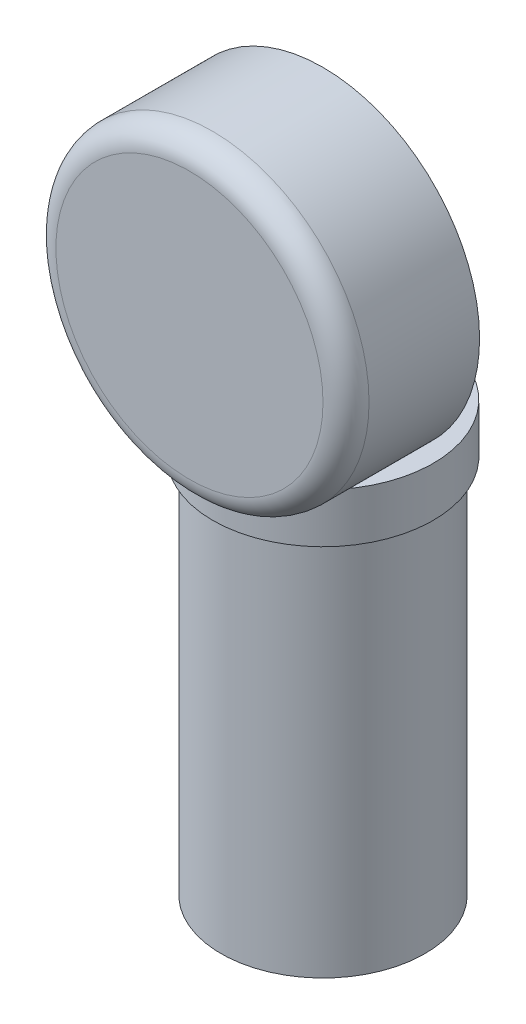
ISO-10303-21;
HEADER;
FILE_DESCRIPTION(('STEP AP214'),'2;1');
FILE_NAME('part.step','',(''),(''),'','','');
FILE_SCHEMA(('AUTOMOTIVE_DESIGN { 1 0 10303 214 1 1 1 1 }'));
ENDSEC;
DATA;
#1=APPLICATION_CONTEXT('core data for automotive mechanical design processes');
#2=APPLICATION_PROTOCOL_DEFINITION('international standard','automotive_design',2000,#1);
#3=PRODUCT_CONTEXT('',#1,'mechanical');
#4=PRODUCT('Part','Part','',(#3));
#5=PRODUCT_RELATED_PRODUCT_CATEGORY('part','',(#4));
#6=PRODUCT_DEFINITION_FORMATION('','',#4);
#7=PRODUCT_DEFINITION_CONTEXT('part definition',#1,'design');
#8=PRODUCT_DEFINITION('design','',#6,#7);
#9=PRODUCT_DEFINITION_SHAPE('','',#8);
#10=(LENGTH_UNIT() NAMED_UNIT(*) SI_UNIT(.MILLI.,.METRE.));
#11=(NAMED_UNIT(*) PLANE_ANGLE_UNIT() SI_UNIT($,.RADIAN.));
#12=(NAMED_UNIT(*) SI_UNIT($,.STERADIAN.) SOLID_ANGLE_UNIT());
#13=UNCERTAINTY_MEASURE_WITH_UNIT(LENGTH_MEASURE(1.E-05),#10,'distance_accuracy_value','');
#14=(GEOMETRIC_REPRESENTATION_CONTEXT(3) GLOBAL_UNCERTAINTY_ASSIGNED_CONTEXT((#13)) GLOBAL_UNIT_ASSIGNED_CONTEXT((#10,
#11,#12)) REPRESENTATION_CONTEXT('',''));
#15=CARTESIAN_POINT('',(0.,0.,0.));
#16=DIRECTION('',(0.,0.,1.));
#17=DIRECTION('',(1.,0.,0.));
#18=AXIS2_PLACEMENT_3D('',#15,#16,#17);
#19=CARTESIAN_POINT('',(-6.27280772405116,-36.2819099170688,0.));
#20=DIRECTION('',(0.,-1.,0.));
#21=DIRECTION('',(0.,0.,-1.));
#22=AXIS2_PLACEMENT_3D('',#19,#20,#21);
#23=PLANE('',#22);
#24=CARTESIAN_POINT('',(-6.27280772405116,-36.2819099170688,0.));
#25=DIRECTION('',(0.,1.,0.));
#26=DIRECTION('',(0.,0.,1.));
#27=AXIS2_PLACEMENT_3D('',#24,#25,#26);
#28=CIRCLE('',#27,6.08020546064516);
#29=CARTESIAN_POINT('',(-6.27280772405116,-36.2819099170688,6.08020546064516));
#30=VERTEX_POINT('',#29);
#31=EDGE_CURVE('E68',#30,#30,#28,.T.);
#32=ORIENTED_EDGE('',*,*,#31,.F.);
#33=EDGE_LOOP('',(#32));
#34=FACE_BOUND('',#33,.T.);
#35=CARTESIAN_POINT('',(-6.27280772405116,-36.2819099170688,0.));
#36=DIRECTION('',(0.,-1.,0.));
#37=DIRECTION('',(0.,0.,-1.));
#38=AXIS2_PLACEMENT_3D('',#35,#36,#37);
#39=CIRCLE('',#38,5.62683403156341);
#40=CARTESIAN_POINT('',(-6.27280772405116,-36.2819099170688,-5.62683403156341));
#41=VERTEX_POINT('',#40);
#42=EDGE_CURVE('E168',#41,#41,#39,.T.);
#43=ORIENTED_EDGE('',*,*,#42,.F.);
#44=EDGE_LOOP('',(#43));
#45=FACE_BOUND('',#44,.T.);
#46=ADVANCED_FACE('F30',(#34,#45),#23,.T.);
#47=CARTESIAN_POINT('',(-6.27280772405116,-26.3143599815849,7.36599999999998));
#48=DIRECTION('',(0.,0.,-1.));
#49=DIRECTION('',(-1.,0.,0.));
#50=AXIS2_PLACEMENT_3D('',#47,#48,#49);
#51=CYLINDRICAL_SURFACE('',#50,8.636);
#52=CARTESIAN_POINT('',(-6.27280772405116,-26.3143599815849,6.09599999999998));
#53=DIRECTION('',(0.,0.,1.));
#54=DIRECTION('',(1.,0.,0.));
#55=AXIS2_PLACEMENT_3D('',#52,#53,#54);
#56=CIRCLE('',#55,8.636);
#57=CARTESIAN_POINT('',(2.36319227594884,-26.3143599815849,6.09599999999998));
#58=VERTEX_POINT('',#57);
#59=EDGE_CURVE('E80',#58,#58,#56,.F.);
#60=ORIENTED_EDGE('',*,*,#59,.T.);
#61=EDGE_LOOP('',(#60));
#62=FACE_BOUND('',#61,.T.);
#63=CARTESIAN_POINT('',(-6.27280772405116,-34.9503599815849,6.08020546064516));
#64=CARTESIAN_POINT('',(-6.12182758212127,-34.950360839252,6.0802063714684));
#65=CARTESIAN_POINT('',(-5.97085816476798,-34.9463929394153,6.07457474459403));
#66=CARTESIAN_POINT('',(-5.67016275735546,-34.9306223813735,6.05214379416389));
#67=CARTESIAN_POINT('',(-5.52043676365703,-34.918819746107,6.03534450330483));
#68=CARTESIAN_POINT('',(-5.22340073069609,-34.8876643386465,5.99084317135875));
#69=CARTESIAN_POINT('',(-5.07609099512552,-34.8683106248442,5.96313977054162));
#70=CARTESIAN_POINT('',(-4.78496948308177,-34.8225061793963,5.89724632724683));
#71=CARTESIAN_POINT('',(-4.64115782839198,-34.7960552010486,5.85905592023811));
#72=CARTESIAN_POINT('',(-4.35867580298397,-34.7367889898985,5.77292695861879));
#73=CARTESIAN_POINT('',(-4.21998283921504,-34.7040071071529,5.72503942519365));
#74=CARTESIAN_POINT('',(-3.94768231058322,-34.6326611205405,5.61996586254378));
#75=CARTESIAN_POINT('',(-3.81407663460476,-34.5940948947263,5.56277642032332));
#76=CARTESIAN_POINT('',(-3.42192110617729,-34.4708206741843,5.37816926246686));
#77=CARTESIAN_POINT('',(-3.1717951489574,-34.3784854044519,5.23763902250488));
#78=CARTESIAN_POINT('',(-2.67665176978472,-34.1709903975482,4.9124444579008));
#79=CARTESIAN_POINT('',(-2.43405547630322,-34.0545325839461,4.72497105419681));
#80=CARTESIAN_POINT('',(-1.98144577227559,-33.8130596143578,4.31808357713596));
#81=CARTESIAN_POINT('',(-1.77148215337477,-33.6880317928751,4.09862166471254));
#82=CARTESIAN_POINT('',(-1.46549685427991,-33.4899161441971,3.72699960312644));
#83=CARTESIAN_POINT('',(-1.35807872586271,-33.4165716835784,3.58418534688732));
#84=CARTESIAN_POINT('',(-1.15569284193418,-33.272165788658,3.28878359957141));
#85=CARTESIAN_POINT('',(-1.06072836355384,-33.2011049589842,3.13619355169321));
#86=CARTESIAN_POINT('',(-0.884038803699651,-33.0637434770409,2.82179349303375));
#87=CARTESIAN_POINT('',(-0.802294508863332,-32.9974359960868,2.65999733299808));
#88=CARTESIAN_POINT('',(-0.652729286396061,-32.8721585904756,2.32742389971116));
#89=CARTESIAN_POINT('',(-0.584906395551781,-32.8131876316759,2.15664789708095));
#90=CARTESIAN_POINT('',(-0.441876249965573,-32.6856298045542,1.74164290380118));
#91=CARTESIAN_POINT('',(-0.373219098104523,-32.6215560786156,1.49361228337817));
#92=CARTESIAN_POINT('',(-0.293918205789608,-32.5461080147967,1.1129321387857));
#93=CARTESIAN_POINT('',(-0.271436989047147,-32.5244076930162,0.984661175112826));
#94=CARTESIAN_POINT('',(-0.234678279629278,-32.4886741609096,0.725902833519679));
#95=CARTESIAN_POINT('',(-0.22039761207438,-32.4746379834791,0.595416333526014));
#96=CARTESIAN_POINT('',(-0.20025040191613,-32.4547790635678,0.332354765323989));
#97=CARTESIAN_POINT('',(-0.194436398090059,-32.449007610403,0.199771773685017));
#98=CARTESIAN_POINT('',(-0.191508520587281,-32.4461053284381,-0.0655838807517806));
#99=CARTESIAN_POINT('',(-0.194394408041896,-32.4489742624031,-0.198356538241999));
#100=CARTESIAN_POINT('',(-0.208809964193385,-32.4632239240657,-0.463041259061182));
#101=CARTESIAN_POINT('',(-0.220344507112269,-32.474609451549,-0.594952794775049));
#102=CARTESIAN_POINT('',(-0.251836752279032,-32.505392668051,-0.856866986625794));
#103=CARTESIAN_POINT('',(-0.27179863368914,-32.5247943322129,-0.986868662508698));
#104=CARTESIAN_POINT('',(-0.323057027705727,-32.573943433209,-1.26151907234019));
#105=CARTESIAN_POINT('',(-0.355523730223377,-32.6047372348682,-1.40576265359948));
#106=CARTESIAN_POINT('',(-0.430274233523286,-32.6742268663125,-1.68976420873328));
#107=CARTESIAN_POINT('',(-0.472564642387174,-32.7129280129867,-1.8295190908579));
#108=CARTESIAN_POINT('',(-0.613400246992451,-32.8387283979856,-2.24148361344046));
#109=CARTESIAN_POINT('',(-0.725862574318351,-32.9354762164405,-2.50614807047482));
#110=CARTESIAN_POINT('',(-0.937821284170871,-33.1062572586609,-2.92240711055735));
#111=CARTESIAN_POINT('',(-1.02777121316522,-33.1761778097678,-3.08081366469654));
#112=CARTESIAN_POINT('',(-1.22072443905945,-33.3194562983821,-3.38795110658393));
#113=CARTESIAN_POINT('',(-1.32373116491357,-33.3928151356454,-3.53667943706914));
#114=CARTESIAN_POINT('',(-1.54231441667562,-33.5407260856052,-3.82413036999678));
#115=CARTESIAN_POINT('',(-1.65790046482433,-33.6152790653188,-3.96284525853147));
#116=CARTESIAN_POINT('',(-1.90118764959011,-33.7635022700277,-4.22970747293164));
#117=CARTESIAN_POINT('',(-2.0288876209254,-33.8371725791638,-4.35785581301914));
#118=CARTESIAN_POINT('',(-2.2971676500341,-33.9823609267174,-4.60397583503645));
#119=CARTESIAN_POINT('',(-2.43784543452535,-34.0538561454282,-4.72185465759165));
#120=CARTESIAN_POINT('',(-2.73077522400977,-34.1922237698826,-4.94538598532523));
#121=CARTESIAN_POINT('',(-2.88302832778588,-34.2590957356124,-5.05103732740752));
#122=CARTESIAN_POINT('',(-3.19821042543973,-34.3862973559236,-5.24883781173237));
#123=CARTESIAN_POINT('',(-3.36111840287321,-34.4466393014835,-5.34101243925657));
#124=CARTESIAN_POINT('',(-3.6969887686162,-34.5591755487012,-5.510846696945));
#125=CARTESIAN_POINT('',(-3.86994737279798,-34.6113728899267,-5.58851174423223));
#126=CARTESIAN_POINT('',(-4.17958874625599,-34.6939599317106,-5.71030238146495));
#127=CARTESIAN_POINT('',(-4.31432403918882,-34.726520940765,-5.75793601800367));
#128=CARTESIAN_POINT('',(-4.58802048735653,-34.7855802299085,-5.8438815452702));
#129=CARTESIAN_POINT('',(-4.72698074474364,-34.8120797880555,-5.88219540118327));
#130=CARTESIAN_POINT('',(-5.0082522634317,-34.858463274667,-5.94900674934513));
#131=CARTESIAN_POINT('',(-5.15056173334508,-34.8783506573702,-5.97750936731706));
#132=CARTESIAN_POINT('',(-5.43765623632309,-34.9110971199486,-6.02433169503464));
#133=CARTESIAN_POINT('',(-5.58244134125479,-34.9239559954296,-6.04265110864536));
#134=CARTESIAN_POINT('',(-5.87383602414972,-34.942377686195,-6.06886970765923));
#135=CARTESIAN_POINT('',(-6.02044963167348,-34.9479195602315,-6.07673898515825));
#136=CARTESIAN_POINT('',(-6.31395385605131,-34.9515089439275,-6.08183754675664));
#137=CARTESIAN_POINT('',(-6.4608444722228,-34.9495564720302,-6.07906685704025));
#138=CARTESIAN_POINT('',(-6.7537686433489,-34.9382024599001,-6.06292786778696));
#139=CARTESIAN_POINT('',(-6.8998020880043,-34.9287999813035,-6.04955823326221));
#140=CARTESIAN_POINT('',(-7.18988055441477,-34.9027639473091,-6.01242544580199));
#141=CARTESIAN_POINT('',(-7.33392560243798,-34.8861304875323,-5.98866243030636));
#142=CARTESIAN_POINT('',(-7.61308267589068,-34.8468384399348,-5.93228313187176));
#143=CARTESIAN_POINT('',(-7.74831705994887,-34.8244592255949,-5.90007618479412));
#144=CARTESIAN_POINT('',(-8.01526737605205,-34.773841157113,-5.82682747239861));
#145=CARTESIAN_POINT('',(-8.14698208021854,-34.7456002874306,-5.7857826679862));
#146=CARTESIAN_POINT('',(-8.53572410371695,-34.6528546766145,-5.65007158646898));
#147=CARTESIAN_POINT('',(-8.78655917322666,-34.5802962376912,-5.54278542195723));
#148=CARTESIAN_POINT('',(-9.29030920159082,-34.4108149346538,-5.28687448134575));
#149=CARTESIAN_POINT('',(-9.54112294103336,-34.3122242383191,-5.13527482402616));
#150=CARTESIAN_POINT('',(-10.0150771255766,-34.1017320956216,-4.80088626336528));
#151=CARTESIAN_POINT('',(-10.2381935033919,-33.989819236241,-4.61807055833436));
#152=CARTESIAN_POINT('',(-10.5692054479243,-33.8071028184969,-4.30562311054284));
#153=CARTESIAN_POINT('',(-10.6868226531887,-33.7382667422516,-4.18493586633868));
#154=CARTESIAN_POINT('',(-10.9114939858632,-33.599993837733,-3.93443571806909));
#155=CARTESIAN_POINT('',(-11.0185503296336,-33.530557138851,-3.80462473859571));
#156=CARTESIAN_POINT('',(-11.2218447305029,-33.3926803844345,-3.53614102868273));
#157=CARTESIAN_POINT('',(-11.3180766285975,-33.3242409153978,-3.39746332283687));
#158=CARTESIAN_POINT('',(-11.4991933618796,-33.1902666364639,-3.11166155891045));
#159=CARTESIAN_POINT('',(-11.5840804811025,-33.1247312436727,-2.96453920953549));
#160=CARTESIAN_POINT('',(-11.7929954439671,-32.9578218085892,-2.56421268291352));
#161=CARTESIAN_POINT('',(-11.9069793806371,-32.8605785575238,-2.30376198527085));
#162=CARTESIAN_POINT('',(-12.0508942074987,-32.7329548204359,-1.89820661566485));
#163=CARTESIAN_POINT('',(-12.094342738244,-32.6934668535111,-1.76060408308878));
#164=CARTESIAN_POINT('',(-12.1717004299791,-32.6220004497914,-1.48087210470489));
#165=CARTESIAN_POINT('',(-12.2056159369781,-32.5900170196792,-1.33874574084755));
#166=CARTESIAN_POINT('',(-12.2585797348054,-32.5394817914773,-1.0744720721293));
#167=CARTESIAN_POINT('',(-12.2791561713099,-32.5195857729168,-0.952885999026663));
#168=CARTESIAN_POINT('',(-12.3129392035675,-32.4867068675063,-0.707811191505076));
#169=CARTESIAN_POINT('',(-12.3261492927761,-32.4737207038242,-0.584323387575758));
#170=CARTESIAN_POINT('',(-12.3449799065613,-32.4551578057299,-0.33627970223861));
#171=CARTESIAN_POINT('',(-12.3506046224302,-32.4495769795316,-0.211724448971407));
#172=CARTESIAN_POINT('',(-12.3541751577533,-32.4460377315236,0.0376080507890457));
#173=CARTESIAN_POINT('',(-12.3521208132056,-32.4480794725093,0.162385301966627));
#174=CARTESIAN_POINT('',(-12.3403761509708,-32.459698004582,0.411080684594492));
#175=CARTESIAN_POINT('',(-12.3306946823503,-32.4692660635392,0.534999643871226));
#176=CARTESIAN_POINT('',(-12.303882501561,-32.4955386981204,0.781282217611884));
#177=CARTESIAN_POINT('',(-12.2867492314137,-32.5122457243018,0.903645283125982));
#178=CARTESIAN_POINT('',(-12.2245284142977,-32.5722292863014,1.26743486997021));
#179=CARTESIAN_POINT('',(-12.1686252190546,-32.6253624966728,1.50545526506624));
#180=CARTESIAN_POINT('',(-12.0058025108181,-32.7741721483763,2.05179351314644));
#181=CARTESIAN_POINT('',(-11.8877502900736,-32.8782827846253,2.35445846088297));
#182=CARTESIAN_POINT('',(-11.6791311677519,-33.0493688054704,2.7868088662144));
#183=CARTESIAN_POINT('',(-11.6042162053418,-33.1089717280282,2.92748722388883));
#184=CARTESIAN_POINT('',(-11.4442909182467,-33.231467691899,3.20153066099865));
#185=CARTESIAN_POINT('',(-11.3592814872095,-33.2943604416931,3.33489638628455));
#186=CARTESIAN_POINT('',(-11.1773487202686,-33.4234196767145,3.59729186591927));
#187=CARTESIAN_POINT('',(-11.0801811553613,-33.4896286888943,3.72613056672692));
#188=CARTESIAN_POINT('',(-10.8759972668257,-33.6222983953372,3.97561587716325));
#189=CARTESIAN_POINT('',(-10.7689810383115,-33.6887590871638,4.09626256588721));
#190=CARTESIAN_POINT('',(-10.5454410020698,-33.8204855627597,4.3289154580606));
#191=CARTESIAN_POINT('',(-10.4289240675743,-33.8857521692574,4.44092779583842));
#192=CARTESIAN_POINT('',(-10.1865664245721,-34.0138256864562,4.65592388747999));
#193=CARTESIAN_POINT('',(-10.0607258733588,-34.0766326386254,4.7589077935933));
#194=CARTESIAN_POINT('',(-9.8056774418525,-34.1958748421009,4.95096908818851));
#195=CARTESIAN_POINT('',(-9.67685228862139,-34.2524682959558,5.0404558889484));
#196=CARTESIAN_POINT('',(-9.41134690624862,-34.3611377138092,5.20991930898707));
#197=CARTESIAN_POINT('',(-9.27466993712418,-34.4132155304509,5.28989983347383));
#198=CARTESIAN_POINT('',(-8.99385520688584,-34.5118318908357,5.43968069830153));
#199=CARTESIAN_POINT('',(-8.84971507185308,-34.5583686563303,5.50947777215364));
#200=CARTESIAN_POINT('',(-8.55475616836273,-34.6448348403038,5.63803828192333));
#201=CARTESIAN_POINT('',(-8.40394060444938,-34.6847673864566,5.69680694254278));
#202=CARTESIAN_POINT('',(-8.09390014192865,-34.7576941547101,5.80343288423995));
#203=CARTESIAN_POINT('',(-7.9345771357777,-34.7905620233932,5.85109257220067));
#204=CARTESIAN_POINT('',(-7.61107770791994,-34.8476184728114,5.93344634111633));
#205=CARTESIAN_POINT('',(-7.446901236124,-34.871806963939,5.9681402882107));
#206=CARTESIAN_POINT('',(-7.11527225062274,-34.9107894619232,6.02390238480121));
#207=CARTESIAN_POINT('',(-6.94782234858993,-34.9255906663925,6.04498097397299));
#208=CARTESIAN_POINT('',(-6.61117957538042,-34.9453748539328,6.07313115735573));
#209=CARTESIAN_POINT('',(-6.44198691678116,-34.9503590205352,6.08020444003185));
#210=CARTESIAN_POINT('',(-6.27280772405116,-34.9503599815849,6.08020546064516));
#211=B_SPLINE_CURVE_WITH_KNOTS('',3,(#63,#64,#65,#66,#67,#68,#69,#70,#71,#72,#73,#74,#75,#76,
#77,#78,#79,#80,#81,#82,#83,#84,#85,#86,#87,#88,#89,#90,#91,#92,#93,#94,#95,#96,#97,#98,#99,
#100,#101,#102,#103,#104,#105,#106,#107,#108,#109,#110,#111,#112,#113,#114,#115,#116,#117,#118,
#119,#120,#121,#122,#123,#124,#125,#126,#127,#128,#129,#130,#131,#132,#133,#134,#135,#136,#137,
#138,#139,#140,#141,#142,#143,#144,#145,#146,#147,#148,#149,#150,#151,#152,#153,#154,#155,#156,
#157,#158,#159,#160,#161,#162,#163,#164,#165,#166,#167,#168,#169,#170,#171,#172,#173,#174,#175,
#176,#177,#178,#179,#180,#181,#182,#183,#184,#185,#186,#187,#188,#189,#190,#191,#192,#193,#194,
#195,#196,#197,#198,#199,#200,#201,#202,#203,#204,#205,#206,#207,#208,#209,#210),.UNSPECIFIED.,
.T.,.F.,(4,2,2,2,2,2,2,2,2,2,2,2,2,2,2,2,2,2,2,2,2,2,2,2,2,2,2,2,2,2,2,2,2,2,2,2,2,2,2,2,2,2,2,
2,2,2,2,2,2,2,2,2,2,2,2,2,2,2,2,2,2,2,2,2,2,2,2,2,2,2,2,2,2,4),(0.,0.452766259462559,
0.905531193321212,1.35835260434827,1.81118975755847,2.26170349287054,2.71238290218727,
3.61298784460781,4.59347804529457,5.57544991478151,6.15439467865105,6.73349148524966,
7.31173895614385,7.88990482576697,8.68195645579298,9.07761564855021,9.47312155661726,
9.87107141828065,10.2690103537281,10.6671737289172,11.0655347878214,11.5179311164808,
11.9706326429172,12.8767889086902,13.4615810033225,14.0465269945075,14.6319188965973,
15.2172545447291,15.807427775519,16.3976570984031,16.9867554103718,17.5756333421955,
18.0149027124572,18.4540793771607,18.8930262516215,19.3319858903064,19.7721991270581,
20.2124112804755,20.652678889532,21.0929406767602,21.5148909634975,21.9369865796445,
22.7805355953202,23.7048672263764,24.6299965041356,25.1756449128337,25.7211785640451,
26.2670210649844,26.8127535057937,27.7102855904148,28.158665479935,28.6067461780869,
28.9810872941949,29.3552507294785,29.7292073362149,30.1031719296009,30.4767032833185,
30.8503629604041,31.5979987819556,32.6156138010417,33.1257545709786,33.6358502125508,
34.1586658040429,34.6814763469427,35.2039119653086,35.7263387719675,36.2261084640089,
36.7256721342598,37.225395696129,37.7248819133733,38.23267008273,38.740463494436,
39.2478670881738,39.7552095061378),.UNSPECIFIED.);
#212=CARTESIAN_POINT('',(-10.9758064532681,-33.5574462680365,3.85366077861596));
#213=VERTEX_POINT('',#212);
#214=CARTESIAN_POINT('',(-1.56980899483421,-33.5574462680365,3.85366077861596));
#215=VERTEX_POINT('',#214);
#216=EDGE_CURVE('E11',#213,#215,#211,.T.);
#217=ORIENTED_EDGE('',*,*,#216,.T.);
#218=DIRECTION('',(0.,0.,-1.));
#219=VECTOR('',#218,1.);
#220=CARTESIAN_POINT('',(-1.56980899483421,-33.5574462680365,7.36599999999998));
#221=LINE('',#220,#219);
#222=CARTESIAN_POINT('',(-1.56980899483421,-33.5574462680365,0.));
#223=VERTEX_POINT('',#222);
#224=EDGE_CURVE('E57',#215,#223,#221,.T.);
#225=ORIENTED_EDGE('',*,*,#224,.T.);
#226=CARTESIAN_POINT('',(-6.27280772405116,-26.3143599815849,0.));
#227=DIRECTION('',(0.,0.,1.));
#228=DIRECTION('',(1.,0.,0.));
#229=AXIS2_PLACEMENT_3D('',#226,#227,#228);
#230=CIRCLE('',#229,8.636);
#231=CARTESIAN_POINT('',(-10.9758064532681,-33.5574462680365,0.));
#232=VERTEX_POINT('',#231);
#233=EDGE_CURVE('E64',#223,#232,#230,.T.);
#234=ORIENTED_EDGE('',*,*,#233,.T.);
#235=DIRECTION('',(0.,0.,-1.));
#236=VECTOR('',#235,1.);
#237=CARTESIAN_POINT('',(-10.9758064532681,-33.5574462680365,7.36599999999998));
#238=LINE('',#237,#236);
#239=EDGE_CURVE('E48',#232,#213,#238,.F.);
#240=ORIENTED_EDGE('',*,*,#239,.T.);
#241=EDGE_LOOP('',(#217,#225,#234,#240));
#242=FACE_BOUND('',#241,.T.);
#243=ADVANCED_FACE('F71',(#62,#242),#51,.T.);
#244=CARTESIAN_POINT('',(-6.27280772405116,-26.3143599815849,7.36599999999998));
#245=DIRECTION('',(0.,0.,1.));
#246=DIRECTION('',(1.,0.,0.));
#247=AXIS2_PLACEMENT_3D('',#244,#245,#246);
#248=PLANE('',#247);
#249=CARTESIAN_POINT('',(-6.27280772405116,-26.3143599815849,7.36599999999998));
#250=DIRECTION('',(0.,0.,1.));
#251=DIRECTION('',(1.,0.,0.));
#252=AXIS2_PLACEMENT_3D('',#249,#250,#251);
#253=CIRCLE('',#252,7.366);
#254=CARTESIAN_POINT('',(1.09319227594884,-26.3143599815849,7.36599999999998));
#255=VERTEX_POINT('',#254);
#256=EDGE_CURVE('E77',#255,#255,#253,.T.);
#257=ORIENTED_EDGE('',*,*,#256,.T.);
#258=EDGE_LOOP('',(#257));
#259=FACE_BOUND('',#258,.T.);
#260=ADVANCED_FACE('F85',(#259),#248,.T.);
#261=CARTESIAN_POINT('',(-6.27280772405116,-26.3143599815849,0.));
#262=DIRECTION('',(0.,0.,1.));
#263=DIRECTION('',(1.,0.,0.));
#264=AXIS2_PLACEMENT_3D('',#261,#262,#263);
#265=PLANE('',#264);
#266=ORIENTED_EDGE('',*,*,#233,.F.);
#267=DIRECTION('',(-1.,0.,0.));
#268=VECTOR('',#267,1.);
#269=CARTESIAN_POINT('',(-6.27280772405116,-33.5574462680365,0.));
#270=LINE('',#269,#268);
#271=EDGE_CURVE('E41',#223,#232,#270,.T.);
#272=ORIENTED_EDGE('',*,*,#271,.T.);
#273=EDGE_LOOP('',(#266,#272));
#274=FACE_BOUND('',#273,.T.);
#275=ADVANCED_FACE('F83',(#274),#265,.F.);
#276=CARTESIAN_POINT('',(-6.27280772405116,-26.3143599815849,6.09599999999998));
#277=DIRECTION('',(0.,0.,1.));
#278=DIRECTION('',(1.,0.,0.));
#279=AXIS2_PLACEMENT_3D('',#276,#277,#278);
#280=TOROIDAL_SURFACE('',#279,7.366,1.27);
#281=ORIENTED_EDGE('',*,*,#59,.F.);
#282=EDGE_LOOP('',(#281));
#283=FACE_BOUND('',#282,.T.);
#284=ORIENTED_EDGE('',*,*,#256,.F.);
#285=EDGE_LOOP('',(#284));
#286=FACE_BOUND('',#285,.T.);
#287=ADVANCED_FACE('F32',(#283,#286),#280,.T.);
#288=CARTESIAN_POINT('',(-6.27280772405116,-33.5574462680365,0.));
#289=DIRECTION('',(0.,1.,0.));
#290=DIRECTION('',(0.,0.,1.));
#291=AXIS2_PLACEMENT_3D('',#288,#289,#290);
#292=CYLINDRICAL_SURFACE('',#291,6.08020546064516);
#293=ORIENTED_EDGE('',*,*,#31,.T.);
#294=EDGE_LOOP('',(#293));
#295=FACE_BOUND('',#294,.T.);
#296=ORIENTED_EDGE('',*,*,#216,.F.);
#297=CARTESIAN_POINT('',(-6.27280772405116,-33.5574462680365,0.));
#298=DIRECTION('',(0.,1.,0.));
#299=DIRECTION('',(0.,0.,1.));
#300=AXIS2_PLACEMENT_3D('',#297,#298,#299);
#301=CIRCLE('',#300,6.08020546064516);
#302=EDGE_CURVE('E60',#215,#213,#301,.T.);
#303=ORIENTED_EDGE('',*,*,#302,.F.);
#304=EDGE_LOOP('',(#296,#303));
#305=FACE_BOUND('',#304,.T.);
#306=ADVANCED_FACE('F67',(#295,#305),#292,.T.);
#307=CARTESIAN_POINT('',(-12.3530131846963,-33.5574462680365,0.));
#308=DIRECTION('',(0.,1.,0.));
#309=DIRECTION('',(0.,0.,1.));
#310=AXIS2_PLACEMENT_3D('',#307,#308,#309);
#311=PLANE('',#310);
#312=ORIENTED_EDGE('',*,*,#224,.F.);
#313=ORIENTED_EDGE('',*,*,#302,.T.);
#314=ORIENTED_EDGE('',*,*,#239,.F.);
#315=ORIENTED_EDGE('',*,*,#271,.F.);
#316=EDGE_LOOP('',(#312,#313,#314,#315));
#317=FACE_BOUND('',#316,.T.);
#318=ADVANCED_FACE('F59',(#317),#311,.T.);
#319=CARTESIAN_POINT('',(-6.27280772405116,-57.2047903286751,0.));
#320=DIRECTION('',(0.,1.,0.));
#321=DIRECTION('',(0.,0.,1.));
#322=AXIS2_PLACEMENT_3D('',#319,#320,#321);
#323=CYLINDRICAL_SURFACE('',#322,5.62683403156341);
#324=CARTESIAN_POINT('',(-6.27280772405116,-57.2047903286751,0.));
#325=DIRECTION('',(0.,-1.,0.));
#326=DIRECTION('',(0.,0.,-1.));
#327=AXIS2_PLACEMENT_3D('',#324,#325,#326);
#328=CIRCLE('',#327,5.62683403156341);
#329=CARTESIAN_POINT('',(-6.27280772405116,-57.2047903286751,-5.62683403156341));
#330=VERTEX_POINT('',#329);
#331=EDGE_CURVE('E69',#330,#330,#328,.T.);
#332=ORIENTED_EDGE('',*,*,#331,.F.);
#333=EDGE_LOOP('',(#332));
#334=FACE_BOUND('',#333,.T.);
#335=ORIENTED_EDGE('',*,*,#42,.T.);
#336=EDGE_LOOP('',(#335));
#337=FACE_BOUND('',#336,.T.);
#338=ADVANCED_FACE('F107',(#334,#337),#323,.T.);
#339=CARTESIAN_POINT('',(-6.27280772405116,-57.2047903286751,0.));
#340=DIRECTION('',(0.,-1.,0.));
#341=DIRECTION('',(0.,0.,-1.));
#342=AXIS2_PLACEMENT_3D('',#339,#340,#341);
#343=PLANE('',#342);
#344=ORIENTED_EDGE('',*,*,#331,.T.);
#345=EDGE_LOOP('',(#344));
#346=FACE_BOUND('',#345,.T.);
#347=ADVANCED_FACE('F112',(#346),#343,.T.);
#348=CLOSED_SHELL('',(#46,#243,#260,#275,#287,#306,#318,#338,#347));
#349=MANIFOLD_SOLID_BREP('B2',#348);
#350=ADVANCED_BREP_SHAPE_REPRESENTATION('',(#18,#349),#14);
#351=SHAPE_DEFINITION_REPRESENTATION(#9,#350);
ENDSEC;
END-ISO-10303-21;
